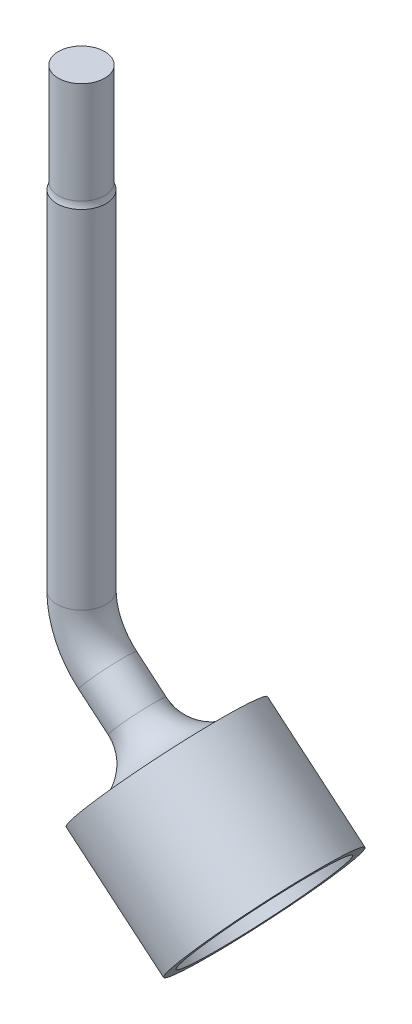
ISO-10303-21;
HEADER;
FILE_DESCRIPTION(('STEP AP214'),'2;1');
FILE_NAME('part.step','',(''),(''),'','','');
FILE_SCHEMA(('AUTOMOTIVE_DESIGN { 1 0 10303 214 1 1 1 1 }'));
ENDSEC;
DATA;
#1=APPLICATION_CONTEXT('core data for automotive mechanical design processes');
#2=APPLICATION_PROTOCOL_DEFINITION('international standard','automotive_design',2000,#1);
#3=PRODUCT_CONTEXT('',#1,'mechanical');
#4=PRODUCT('Part','Part','',(#3));
#5=PRODUCT_RELATED_PRODUCT_CATEGORY('part','',(#4));
#6=PRODUCT_DEFINITION_FORMATION('','',#4);
#7=PRODUCT_DEFINITION_CONTEXT('part definition',#1,'design');
#8=PRODUCT_DEFINITION('design','',#6,#7);
#9=PRODUCT_DEFINITION_SHAPE('','',#8);
#10=(LENGTH_UNIT() NAMED_UNIT(*) SI_UNIT(.MILLI.,.METRE.));
#11=(NAMED_UNIT(*) PLANE_ANGLE_UNIT() SI_UNIT($,.RADIAN.));
#12=(NAMED_UNIT(*) SI_UNIT($,.STERADIAN.) SOLID_ANGLE_UNIT());
#13=UNCERTAINTY_MEASURE_WITH_UNIT(LENGTH_MEASURE(1.E-05),#10,'distance_accuracy_value','');
#14=(GEOMETRIC_REPRESENTATION_CONTEXT(3) GLOBAL_UNCERTAINTY_ASSIGNED_CONTEXT((#13)) GLOBAL_UNIT_ASSIGNED_CONTEXT((#10,
#11,#12)) REPRESENTATION_CONTEXT('',''));
#15=CARTESIAN_POINT('',(0.,0.,0.));
#16=DIRECTION('',(0.,0.,1.));
#17=DIRECTION('',(1.,0.,0.));
#18=AXIS2_PLACEMENT_3D('',#15,#16,#17);
#19=CARTESIAN_POINT('',(0.,40.,0.));
#20=DIRECTION('',(0.,-1.,0.));
#21=DIRECTION('',(0.,0.,-1.));
#22=AXIS2_PLACEMENT_3D('',#19,#20,#21);
#23=CYLINDRICAL_SURFACE('',#22,3.175);
#24=CARTESIAN_POINT('',(0.,40.,0.));
#25=DIRECTION('',(0.,1.,0.));
#26=DIRECTION('',(0.,0.,1.));
#27=AXIS2_PLACEMENT_3D('',#24,#25,#26);
#28=CIRCLE('',#27,3.175);
#29=CARTESIAN_POINT('',(0.,40.,3.175));
#30=VERTEX_POINT('',#29);
#31=EDGE_CURVE('E56',#30,#30,#28,.T.);
#32=ORIENTED_EDGE('',*,*,#31,.F.);
#33=EDGE_LOOP('',(#32));
#34=FACE_BOUND('',#33,.T.);
#35=CARTESIAN_POINT('',(0.,-5.,0.));
#36=DIRECTION('',(0.,-1.,0.));
#37=DIRECTION('',(0.,0.,-1.));
#38=AXIS2_PLACEMENT_3D('',#35,#36,#37);
#39=CIRCLE('',#38,3.175);
#40=CARTESIAN_POINT('',(-3.175,-5.,0.));
#41=VERTEX_POINT('',#40);
#42=EDGE_CURVE('E62',#41,#41,#39,.T.);
#43=ORIENTED_EDGE('',*,*,#42,.F.);
#44=EDGE_LOOP('',(#43));
#45=FACE_BOUND('',#44,.T.);
#46=ADVANCED_FACE('F36',(#34,#45),#23,.T.);
#47=CARTESIAN_POINT('',(3.40244801773573,-12.2965733207083,0.));
#48=DIRECTION('',(0.76604444311898,-0.642787609686537,0.));
#49=DIRECTION('',(0.642787609686537,0.76604444311898,0.));
#50=AXIS2_PLACEMENT_3D('',#47,#48,#49);
#51=CYLINDRICAL_SURFACE('',#50,3.175);
#52=CARTESIAN_POINT('',(7.23267023333063,-15.510511369141,0.));
#53=DIRECTION('',(0.76604444311898,-0.642787609686537,0.));
#54=DIRECTION('',(0.642787609686537,0.76604444311898,0.));
#55=AXIS2_PLACEMENT_3D('',#52,#53,#54);
#56=CIRCLE('',#55,3.175);
#57=CARTESIAN_POINT('',(9.27352089408539,-13.0783202622382,0.));
#58=VERTEX_POINT('',#57);
#59=EDGE_CURVE('E10',#58,#58,#56,.F.);
#60=ORIENTED_EDGE('',*,*,#59,.T.);
#61=EDGE_LOOP('',(#60));
#62=FACE_BOUND('',#61,.T.);
#63=CARTESIAN_POINT('',(3.40244801773573,-12.2965733207083,0.));
#64=DIRECTION('',(0.76604444311898,-0.642787609686537,0.));
#65=DIRECTION('',(0.,0.,-1.));
#66=AXIS2_PLACEMENT_3D('',#63,#64,#65);
#67=CIRCLE('',#66,3.175);
#68=CARTESIAN_POINT('',(1.36159735698098,-14.728764427611,0.));
#69=VERTEX_POINT('',#68);
#70=EDGE_CURVE('E59',#69,#69,#67,.T.);
#71=ORIENTED_EDGE('',*,*,#70,.T.);
#72=EDGE_LOOP('',(#71));
#73=FACE_BOUND('',#72,.T.);
#74=ADVANCED_FACE('F96',(#62,#73),#51,.T.);
#75=CARTESIAN_POINT('',(9.525,-5.,0.));
#76=DIRECTION('',(0.,0.,1.));
#77=DIRECTION('',(1.,0.,0.));
#78=AXIS2_PLACEMENT_3D('',#75,#76,#77);
#79=TOROIDAL_SURFACE('',#78,9.525,3.175);
#80=CARTESIAN_POINT('',(9.525,-5.,0.));
#81=DIRECTION('',(0.,0.,1.));
#82=DIRECTION('',(1.,0.,0.));
#83=AXIS2_PLACEMENT_3D('',#80,#81,#82);
#84=CIRCLE('',#83,12.7);
#85=EDGE_CURVE('',#41,#69,#84,.T.);
#86=ORIENTED_EDGE('',*,*,#42,.T.);
#87=ORIENTED_EDGE('',*,*,#70,.F.);
#88=ORIENTED_EDGE('',*,*,#85,.T.);
#89=ORIENTED_EDGE('',*,*,#85,.F.);
#90=EDGE_LOOP('',(#86,#88,#87,#89));
#91=FACE_BOUND('',#90,.T.);
#92=ADVANCED_FACE('F102',(#91),#79,.T.);
#93=CARTESIAN_POINT('',(12.211959113604,-19.6886308321035,0.));
#94=DIRECTION('',(-0.76604444311898,0.642787609686537,0.));
#95=DIRECTION('',(-0.642787609686537,-0.76604444311898,0.));
#96=AXIS2_PLACEMENT_3D('',#93,#94,#95);
#97=CYLINDRICAL_SURFACE('',#96,11.);
#98=CARTESIAN_POINT('',(11.0628924489255,-18.7244494175737,0.));
#99=DIRECTION('',(0.76604444311898,-0.642787609686537,0.));
#100=DIRECTION('',(0.642787609686537,0.76604444311898,0.));
#101=AXIS2_PLACEMENT_3D('',#98,#99,#100);
#102=CIRCLE('',#101,11.);
#103=CARTESIAN_POINT('',(18.1335561554774,-10.2979605432649,0.));
#104=VERTEX_POINT('',#103);
#105=EDGE_CURVE('E65',#104,#104,#102,.T.);
#106=ORIENTED_EDGE('',*,*,#105,.T.);
#107=EDGE_LOOP('',(#106));
#108=FACE_BOUND('',#107,.T.);
#109=CARTESIAN_POINT('',(23.7026257603887,-29.3304449774015,0.));
#110=DIRECTION('',(0.76604444311898,-0.642787609686537,0.));
#111=DIRECTION('',(0.642787609686537,0.76604444311898,0.));
#112=AXIS2_PLACEMENT_3D('',#109,#110,#111);
#113=CIRCLE('',#112,11.);
#114=CARTESIAN_POINT('',(30.7732894669406,-20.9039561030928,0.));
#115=VERTEX_POINT('',#114);
#116=EDGE_CURVE('E68',#115,#115,#113,.T.);
#117=ORIENTED_EDGE('',*,*,#116,.F.);
#118=EDGE_LOOP('',(#117));
#119=FACE_BOUND('',#118,.T.);
#120=ADVANCED_FACE('F130',(#108,#119),#97,.T.);
#121=CARTESIAN_POINT('',(11.0628924489255,-18.7244494175737,0.));
#122=DIRECTION('',(0.76604444311898,-0.642787609686537,0.));
#123=DIRECTION('',(0.642787609686537,0.76604444311898,0.));
#124=AXIS2_PLACEMENT_3D('',#121,#122,#123);
#125=PLANE('',#124);
#126=CARTESIAN_POINT('',(11.0628924489255,-18.7244494175737,0.));
#127=DIRECTION('',(0.76604444311898,-0.642787609686537,0.));
#128=DIRECTION('',(0.642787609686537,0.76604444311898,0.));
#129=AXIS2_PLACEMENT_3D('',#126,#127,#128);
#130=CIRCLE('',#129,8.175);
#131=CARTESIAN_POINT('',(16.317681158113,-12.462036095076,0.));
#132=VERTEX_POINT('',#131);
#133=EDGE_CURVE('E43',#132,#132,#130,.T.);
#134=ORIENTED_EDGE('',*,*,#133,.T.);
#135=EDGE_LOOP('',(#134));
#136=FACE_BOUND('',#135,.T.);
#137=ORIENTED_EDGE('',*,*,#105,.F.);
#138=EDGE_LOOP('',(#137));
#139=FACE_BOUND('',#138,.T.);
#140=ADVANCED_FACE('F124',(#136,#139),#125,.F.);
#141=CARTESIAN_POINT('',(23.7026257603887,-29.3304449774015,0.));
#142=DIRECTION('',(-0.76604444311898,0.642787609686537,0.));
#143=DIRECTION('',(-0.642787609686537,-0.76604444311898,0.));
#144=AXIS2_PLACEMENT_3D('',#141,#142,#143);
#145=CYLINDRICAL_SURFACE('',#144,9.652);
#146=CARTESIAN_POINT('',(23.7026257603887,-29.3304449774015,0.));
#147=DIRECTION('',(0.76604444311898,-0.642787609686537,0.));
#148=DIRECTION('',(0.642787609686537,0.76604444311898,0.));
#149=AXIS2_PLACEMENT_3D('',#146,#147,#148);
#150=CIRCLE('',#149,9.652);
#151=CARTESIAN_POINT('',(29.9068117690832,-21.9365840124171,0.));
#152=VERTEX_POINT('',#151);
#153=EDGE_CURVE('E71',#152,#152,#150,.T.);
#154=ORIENTED_EDGE('',*,*,#153,.T.);
#155=EDGE_LOOP('',(#154));
#156=FACE_BOUND('',#155,.T.);
#157=CARTESIAN_POINT('',(12.211959113604,-19.6886308321035,0.));
#158=DIRECTION('',(0.76604444311898,-0.642787609686537,0.));
#159=DIRECTION('',(0.642787609686537,0.76604444311898,0.));
#160=AXIS2_PLACEMENT_3D('',#157,#158,#159);
#161=CIRCLE('',#160,9.652);
#162=CARTESIAN_POINT('',(18.4161451222985,-12.2947698671191,0.));
#163=VERTEX_POINT('',#162);
#164=EDGE_CURVE('E51',#163,#163,#161,.F.);
#165=ORIENTED_EDGE('',*,*,#164,.T.);
#166=EDGE_LOOP('',(#165));
#167=FACE_BOUND('',#166,.T.);
#168=ADVANCED_FACE('F129',(#156,#167),#145,.F.);
#169=CARTESIAN_POINT('',(28.3516965713223,-23.7898981362465,0.));
#170=DIRECTION('',(0.76604444311898,-0.642787609686537,0.));
#171=DIRECTION('',(0.642787609686537,0.76604444311898,0.));
#172=AXIS2_PLACEMENT_3D('',#169,#170,#171);
#173=PLANE('',#172);
#174=ORIENTED_EDGE('',*,*,#153,.F.);
#175=EDGE_LOOP('',(#174));
#176=FACE_BOUND('',#175,.T.);
#177=ORIENTED_EDGE('',*,*,#116,.T.);
#178=EDGE_LOOP('',(#177));
#179=FACE_BOUND('',#178,.T.);
#180=ADVANCED_FACE('F91',(#176,#179),#173,.T.);
#181=CARTESIAN_POINT('',(12.211959113604,-19.6886308321035,0.));
#182=DIRECTION('',(0.76604444311898,-0.642787609686537,0.));
#183=DIRECTION('',(0.642787609686537,0.76604444311898,0.));
#184=AXIS2_PLACEMENT_3D('',#181,#182,#183);
#185=PLANE('',#184);
#186=ORIENTED_EDGE('',*,*,#164,.F.);
#187=EDGE_LOOP('',(#186));
#188=FACE_BOUND('',#187,.T.);
#189=ADVANCED_FACE('F82',(#188),#185,.T.);
#190=CARTESIAN_POINT('',(0.,54.,0.));
#191=DIRECTION('',(0.,-1.,0.));
#192=DIRECTION('',(0.,0.,-1.));
#193=AXIS2_PLACEMENT_3D('',#190,#191,#192);
#194=CYLINDRICAL_SURFACE('',#193,3.);
#195=CARTESIAN_POINT('',(0.,40.8181534085977,0.));
#196=DIRECTION('',(0.,-1.,0.));
#197=DIRECTION('',(0.,0.,-1.));
#198=AXIS2_PLACEMENT_3D('',#195,#196,#197);
#199=CIRCLE('',#198,3.);
#200=CARTESIAN_POINT('',(0.,40.8181534085977,-3.));
#201=VERTEX_POINT('',#200);
#202=EDGE_CURVE('E47',#201,#201,#199,.F.);
#203=ORIENTED_EDGE('',*,*,#202,.T.);
#204=EDGE_LOOP('',(#203));
#205=FACE_BOUND('',#204,.T.);
#206=CARTESIAN_POINT('',(0.,54.,0.));
#207=DIRECTION('',(0.,1.,0.));
#208=DIRECTION('',(0.,0.,1.));
#209=AXIS2_PLACEMENT_3D('',#206,#207,#208);
#210=CIRCLE('',#209,3.);
#211=CARTESIAN_POINT('',(0.,54.,3.));
#212=VERTEX_POINT('',#211);
#213=EDGE_CURVE('E74',#212,#212,#210,.T.);
#214=ORIENTED_EDGE('',*,*,#213,.F.);
#215=EDGE_LOOP('',(#214));
#216=FACE_BOUND('',#215,.T.);
#217=ADVANCED_FACE('F80',(#205,#216),#194,.T.);
#218=CARTESIAN_POINT('',(0.,54.,0.));
#219=DIRECTION('',(0.,1.,0.));
#220=DIRECTION('',(0.,0.,1.));
#221=AXIS2_PLACEMENT_3D('',#218,#219,#220);
#222=PLANE('',#221);
#223=ORIENTED_EDGE('',*,*,#213,.T.);
#224=EDGE_LOOP('',(#223));
#225=FACE_BOUND('',#224,.T.);
#226=ADVANCED_FACE('F78',(#225),#222,.T.);
#227=CARTESIAN_POINT('',(0.,40.8181534085977,0.));
#228=DIRECTION('',(0.,-1.,0.));
#229=DIRECTION('',(0.,0.,-1.));
#230=AXIS2_PLACEMENT_3D('',#227,#228,#229);
#231=TOROIDAL_SURFACE('',#230,5.,2.);
#232=ORIENTED_EDGE('',*,*,#31,.T.);
#233=EDGE_LOOP('',(#232));
#234=FACE_BOUND('',#233,.T.);
#235=ORIENTED_EDGE('',*,*,#202,.F.);
#236=EDGE_LOOP('',(#235));
#237=FACE_BOUND('',#236,.T.);
#238=ADVANCED_FACE('F89',(#234,#237),#231,.F.);
#239=CARTESIAN_POINT('',(7.23267023333063,-15.510511369141,0.));
#240=DIRECTION('',(0.76604444311898,-0.642787609686537,0.));
#241=DIRECTION('',(0.642787609686537,0.76604444311898,0.));
#242=AXIS2_PLACEMENT_3D('',#239,#240,#241);
#243=TOROIDAL_SURFACE('',#242,8.175,5.);
#244=ORIENTED_EDGE('',*,*,#59,.F.);
#245=EDGE_LOOP('',(#244));
#246=FACE_BOUND('',#245,.T.);
#247=ORIENTED_EDGE('',*,*,#133,.F.);
#248=EDGE_LOOP('',(#247));
#249=FACE_BOUND('',#248,.T.);
#250=ADVANCED_FACE('F38',(#246,#249),#243,.F.);
#251=CLOSED_SHELL('',(#46,#74,#92,#120,#140,#168,#180,#189,#217,#226,#238,#250));
#252=MANIFOLD_SOLID_BREP('B2',#251);
#253=ADVANCED_BREP_SHAPE_REPRESENTATION('',(#18,#252),#14);
#254=SHAPE_DEFINITION_REPRESENTATION(#9,#253);
ENDSEC;
END-ISO-10303-21;
